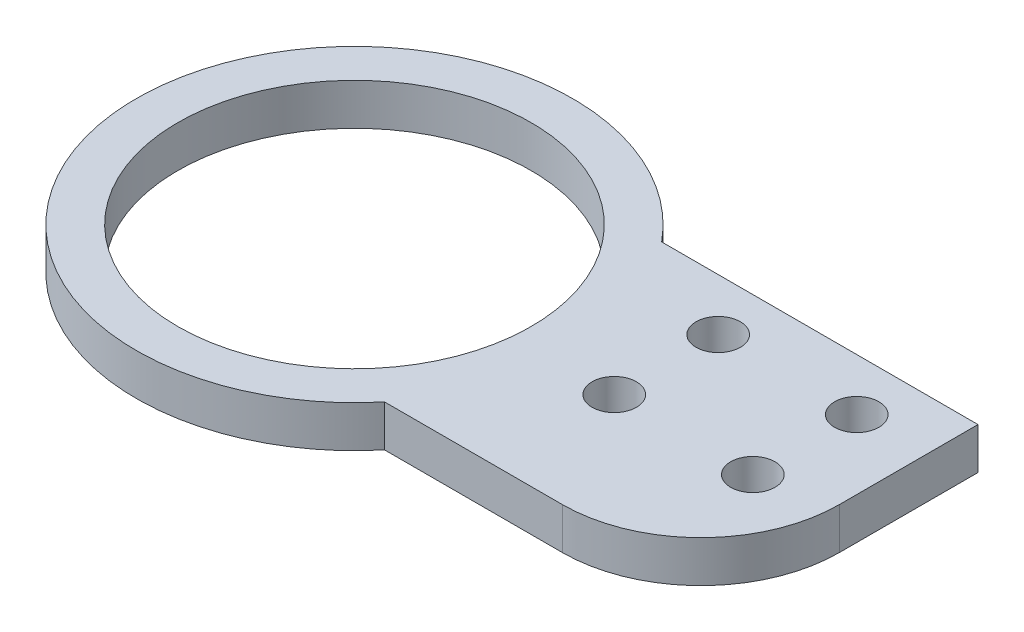
ISO-10303-21;
HEADER;
FILE_DESCRIPTION(('STEP AP214'),'2;1');
FILE_NAME('part.step','',(''),(''),'','','');
FILE_SCHEMA(('AUTOMOTIVE_DESIGN { 1 0 10303 214 1 1 1 1 }'));
ENDSEC;
DATA;
#1=APPLICATION_CONTEXT('core data for automotive mechanical design processes');
#2=APPLICATION_PROTOCOL_DEFINITION('international standard','automotive_design',2000,#1);
#3=PRODUCT_CONTEXT('',#1,'mechanical');
#4=PRODUCT('Part','Part','',(#3));
#5=PRODUCT_RELATED_PRODUCT_CATEGORY('part','',(#4));
#6=PRODUCT_DEFINITION_FORMATION('','',#4);
#7=PRODUCT_DEFINITION_CONTEXT('part definition',#1,'design');
#8=PRODUCT_DEFINITION('design','',#6,#7);
#9=PRODUCT_DEFINITION_SHAPE('','',#8);
#10=(LENGTH_UNIT() NAMED_UNIT(*) SI_UNIT(.MILLI.,.METRE.));
#11=(NAMED_UNIT(*) PLANE_ANGLE_UNIT() SI_UNIT($,.RADIAN.));
#12=(NAMED_UNIT(*) SI_UNIT($,.STERADIAN.) SOLID_ANGLE_UNIT());
#13=UNCERTAINTY_MEASURE_WITH_UNIT(LENGTH_MEASURE(1.E-05),#10,'distance_accuracy_value','');
#14=(GEOMETRIC_REPRESENTATION_CONTEXT(3) GLOBAL_UNCERTAINTY_ASSIGNED_CONTEXT((#13)) GLOBAL_UNIT_ASSIGNED_CONTEXT((#10,
#11,#12)) REPRESENTATION_CONTEXT('',''));
#15=CARTESIAN_POINT('',(0.,0.,0.));
#16=DIRECTION('',(0.,0.,1.));
#17=DIRECTION('',(1.,0.,0.));
#18=AXIS2_PLACEMENT_3D('',#15,#16,#17);
#19=CARTESIAN_POINT('',(0.,3.,0.));
#20=DIRECTION('',(0.,-1.,0.));
#21=DIRECTION('',(0.,0.,-1.));
#22=AXIS2_PLACEMENT_3D('',#19,#20,#21);
#23=PLANE('',#22);
#24=CARTESIAN_POINT('',(-7.5,3.,0.));
#25=DIRECTION('',(0.,1.,0.));
#26=DIRECTION('',(0.,0.,1.));
#27=AXIS2_PLACEMENT_3D('',#24,#25,#26);
#28=CIRCLE('',#27,12.75);
#29=CARTESIAN_POINT('',(-7.5,3.,12.75));
#30=VERTEX_POINT('',#29);
#31=EDGE_CURVE('E130',#30,#30,#28,.T.);
#32=ORIENTED_EDGE('',*,*,#31,.F.);
#33=EDGE_LOOP('',(#32));
#34=FACE_BOUND('',#33,.T.);
#35=CARTESIAN_POINT('',(12.5,3.,-6.25));
#36=DIRECTION('',(0.,1.,0.));
#37=DIRECTION('',(0.,0.,-1.));
#38=AXIS2_PLACEMENT_3D('',#35,#36,#37);
#39=CIRCLE('',#38,1.6);
#40=CARTESIAN_POINT('',(12.5,3.,-7.85));
#41=VERTEX_POINT('',#40);
#42=EDGE_CURVE('E143',#41,#41,#39,.T.);
#43=ORIENTED_EDGE('',*,*,#42,.F.);
#44=EDGE_LOOP('',(#43));
#45=FACE_BOUND('',#44,.T.);
#46=CARTESIAN_POINT('',(22.5,3.,1.25));
#47=DIRECTION('',(0.,1.,0.));
#48=DIRECTION('',(0.,0.,-1.));
#49=AXIS2_PLACEMENT_3D('',#46,#47,#48);
#50=CIRCLE('',#49,1.6);
#51=CARTESIAN_POINT('',(22.5,3.,-0.350000000000002));
#52=VERTEX_POINT('',#51);
#53=EDGE_CURVE('E150',#52,#52,#50,.T.);
#54=ORIENTED_EDGE('',*,*,#53,.F.);
#55=EDGE_LOOP('',(#54));
#56=FACE_BOUND('',#55,.T.);
#57=CARTESIAN_POINT('',(12.5,3.,1.25));
#58=DIRECTION('',(0.,1.,0.));
#59=DIRECTION('',(0.,0.,1.));
#60=AXIS2_PLACEMENT_3D('',#57,#58,#59);
#61=CIRCLE('',#60,1.6);
#62=CARTESIAN_POINT('',(12.5,3.,2.85));
#63=VERTEX_POINT('',#62);
#64=EDGE_CURVE('E137',#63,#63,#61,.T.);
#65=ORIENTED_EDGE('',*,*,#64,.F.);
#66=EDGE_LOOP('',(#65));
#67=FACE_BOUND('',#66,.T.);
#68=CARTESIAN_POINT('',(22.5,3.,-6.25));
#69=DIRECTION('',(0.,1.,0.));
#70=DIRECTION('',(0.,0.,1.));
#71=AXIS2_PLACEMENT_3D('',#68,#69,#70);
#72=CIRCLE('',#71,1.6);
#73=CARTESIAN_POINT('',(22.5,3.,-4.65));
#74=VERTEX_POINT('',#73);
#75=EDGE_CURVE('E146',#74,#74,#72,.T.);
#76=ORIENTED_EDGE('',*,*,#75,.F.);
#77=EDGE_LOOP('',(#76));
#78=FACE_BOUND('',#77,.T.);
#79=DIRECTION('',(1.,0.,0.));
#80=VECTOR('',#79,1.);
#81=CARTESIAN_POINT('',(27.5,3.,10.));
#82=LINE('',#81,#80);
#83=CARTESIAN_POINT('',(4.66809352363796,3.,10.));
#84=VERTEX_POINT('',#83);
#85=CARTESIAN_POINT('',(17.5,3.,10.));
#86=VERTEX_POINT('',#85);
#87=EDGE_CURVE('E103',#84,#86,#82,.T.);
#88=ORIENTED_EDGE('',*,*,#87,.T.);
#89=CARTESIAN_POINT('',(17.5,3.,0.));
#90=DIRECTION('',(0.,-1.,0.));
#91=DIRECTION('',(0.,0.,-1.));
#92=AXIS2_PLACEMENT_3D('',#89,#90,#91);
#93=CIRCLE('',#92,10.);
#94=CARTESIAN_POINT('',(27.5,3.,0.));
#95=VERTEX_POINT('',#94);
#96=EDGE_CURVE('E79',#86,#95,#93,.F.);
#97=ORIENTED_EDGE('',*,*,#96,.T.);
#98=DIRECTION('',(0.,0.,-1.));
#99=VECTOR('',#98,1.);
#100=CARTESIAN_POINT('',(27.5,3.,10.));
#101=LINE('',#100,#99);
#102=CARTESIAN_POINT('',(27.5,3.,-10.));
#103=VERTEX_POINT('',#102);
#104=EDGE_CURVE('E161',#95,#103,#101,.T.);
#105=ORIENTED_EDGE('',*,*,#104,.T.);
#106=DIRECTION('',(-1.,0.,0.));
#107=VECTOR('',#106,1.);
#108=CARTESIAN_POINT('',(-27.5,3.,-10.));
#109=LINE('',#108,#107);
#110=CARTESIAN_POINT('',(4.66809352363797,3.,-10.));
#111=VERTEX_POINT('',#110);
#112=EDGE_CURVE('E105',#103,#111,#109,.T.);
#113=ORIENTED_EDGE('',*,*,#112,.T.);
#114=CARTESIAN_POINT('',(-7.5,3.,0.));
#115=DIRECTION('',(0.,1.,0.));
#116=DIRECTION('',(0.,0.,1.));
#117=AXIS2_PLACEMENT_3D('',#114,#115,#116);
#118=CIRCLE('',#117,15.75);
#119=EDGE_CURVE('E100',#111,#84,#118,.T.);
#120=ORIENTED_EDGE('',*,*,#119,.T.);
#121=EDGE_LOOP('',(#88,#97,#105,#113,#120));
#122=FACE_BOUND('',#121,.T.);
#123=ADVANCED_FACE('F57',(#34,#45,#56,#67,#78,#122),#23,.F.);
#124=CARTESIAN_POINT('',(0.,0.,0.));
#125=DIRECTION('',(0.,-1.,0.));
#126=DIRECTION('',(0.,0.,-1.));
#127=AXIS2_PLACEMENT_3D('',#124,#125,#126);
#128=PLANE('',#127);
#129=CARTESIAN_POINT('',(-7.5,0.,0.));
#130=DIRECTION('',(0.,1.,0.));
#131=DIRECTION('',(0.,0.,1.));
#132=AXIS2_PLACEMENT_3D('',#129,#130,#131);
#133=CIRCLE('',#132,12.75);
#134=CARTESIAN_POINT('',(-7.5,0.,12.75));
#135=VERTEX_POINT('',#134);
#136=EDGE_CURVE('E131',#135,#135,#133,.T.);
#137=ORIENTED_EDGE('',*,*,#136,.T.);
#138=EDGE_LOOP('',(#137));
#139=FACE_BOUND('',#138,.T.);
#140=CARTESIAN_POINT('',(12.5,0.,-6.25));
#141=DIRECTION('',(0.,1.,0.));
#142=DIRECTION('',(0.,0.,-1.));
#143=AXIS2_PLACEMENT_3D('',#140,#141,#142);
#144=CIRCLE('',#143,1.6);
#145=CARTESIAN_POINT('',(12.5,0.,-7.85));
#146=VERTEX_POINT('',#145);
#147=EDGE_CURVE('E147',#146,#146,#144,.T.);
#148=ORIENTED_EDGE('',*,*,#147,.T.);
#149=EDGE_LOOP('',(#148));
#150=FACE_BOUND('',#149,.T.);
#151=CARTESIAN_POINT('',(22.5,0.,1.25));
#152=DIRECTION('',(0.,1.,0.));
#153=DIRECTION('',(0.,0.,-1.));
#154=AXIS2_PLACEMENT_3D('',#151,#152,#153);
#155=CIRCLE('',#154,1.6);
#156=CARTESIAN_POINT('',(22.5,0.,-0.350000000000002));
#157=VERTEX_POINT('',#156);
#158=EDGE_CURVE('E140',#157,#157,#155,.T.);
#159=ORIENTED_EDGE('',*,*,#158,.T.);
#160=EDGE_LOOP('',(#159));
#161=FACE_BOUND('',#160,.T.);
#162=CARTESIAN_POINT('',(12.5,0.,1.25));
#163=DIRECTION('',(0.,1.,0.));
#164=DIRECTION('',(0.,0.,1.));
#165=AXIS2_PLACEMENT_3D('',#162,#163,#164);
#166=CIRCLE('',#165,1.6);
#167=CARTESIAN_POINT('',(12.5,0.,2.85));
#168=VERTEX_POINT('',#167);
#169=EDGE_CURVE('E134',#168,#168,#166,.T.);
#170=ORIENTED_EDGE('',*,*,#169,.T.);
#171=EDGE_LOOP('',(#170));
#172=FACE_BOUND('',#171,.T.);
#173=CARTESIAN_POINT('',(22.5,0.,-6.25));
#174=DIRECTION('',(0.,1.,0.));
#175=DIRECTION('',(0.,0.,1.));
#176=AXIS2_PLACEMENT_3D('',#173,#174,#175);
#177=CIRCLE('',#176,1.6);
#178=CARTESIAN_POINT('',(22.5,0.,-4.65));
#179=VERTEX_POINT('',#178);
#180=EDGE_CURVE('E155',#179,#179,#177,.T.);
#181=ORIENTED_EDGE('',*,*,#180,.T.);
#182=EDGE_LOOP('',(#181));
#183=FACE_BOUND('',#182,.T.);
#184=DIRECTION('',(0.,0.,-1.));
#185=VECTOR('',#184,1.);
#186=CARTESIAN_POINT('',(27.5,0.,10.));
#187=LINE('',#186,#185);
#188=CARTESIAN_POINT('',(27.5,0.,0.));
#189=VERTEX_POINT('',#188);
#190=CARTESIAN_POINT('',(27.5,0.,-10.));
#191=VERTEX_POINT('',#190);
#192=EDGE_CURVE('E158',#189,#191,#187,.T.);
#193=ORIENTED_EDGE('',*,*,#192,.F.);
#194=CARTESIAN_POINT('',(17.5,0.,0.));
#195=DIRECTION('',(0.,-1.,0.));
#196=DIRECTION('',(0.,0.,-1.));
#197=AXIS2_PLACEMENT_3D('',#194,#195,#196);
#198=CIRCLE('',#197,10.);
#199=CARTESIAN_POINT('',(17.5,0.,10.));
#200=VERTEX_POINT('',#199);
#201=EDGE_CURVE('E13',#189,#200,#198,.T.);
#202=ORIENTED_EDGE('',*,*,#201,.T.);
#203=DIRECTION('',(1.,0.,0.));
#204=VECTOR('',#203,1.);
#205=CARTESIAN_POINT('',(27.5,0.,10.));
#206=LINE('',#205,#204);
#207=CARTESIAN_POINT('',(4.66809352363796,0.,10.));
#208=VERTEX_POINT('',#207);
#209=EDGE_CURVE('E118',#208,#200,#206,.T.);
#210=ORIENTED_EDGE('',*,*,#209,.F.);
#211=CARTESIAN_POINT('',(-7.5,0.,0.));
#212=DIRECTION('',(0.,1.,0.));
#213=DIRECTION('',(0.,0.,1.));
#214=AXIS2_PLACEMENT_3D('',#211,#212,#213);
#215=CIRCLE('',#214,15.75);
#216=CARTESIAN_POINT('',(4.66809352363797,0.,-10.));
#217=VERTEX_POINT('',#216);
#218=EDGE_CURVE('E109',#217,#208,#215,.T.);
#219=ORIENTED_EDGE('',*,*,#218,.F.);
#220=DIRECTION('',(-1.,0.,0.));
#221=VECTOR('',#220,1.);
#222=CARTESIAN_POINT('',(-27.5,0.,-10.));
#223=LINE('',#222,#221);
#224=EDGE_CURVE('E163',#191,#217,#223,.T.);
#225=ORIENTED_EDGE('',*,*,#224,.F.);
#226=EDGE_LOOP('',(#193,#202,#210,#219,#225));
#227=FACE_BOUND('',#226,.T.);
#228=ADVANCED_FACE('F178',(#139,#150,#161,#172,#183,#227),#128,.T.);
#229=CARTESIAN_POINT('',(27.5,3.,10.));
#230=DIRECTION('',(-1.,0.,0.));
#231=DIRECTION('',(0.,0.,1.));
#232=AXIS2_PLACEMENT_3D('',#229,#230,#231);
#233=PLANE('',#232);
#234=ORIENTED_EDGE('',*,*,#104,.F.);
#235=DIRECTION('',(0.,1.,0.));
#236=VECTOR('',#235,1.);
#237=CARTESIAN_POINT('',(27.5,0.,0.));
#238=LINE('',#237,#236);
#239=EDGE_CURVE('E65',#95,#189,#238,.F.);
#240=ORIENTED_EDGE('',*,*,#239,.T.);
#241=ORIENTED_EDGE('',*,*,#192,.T.);
#242=DIRECTION('',(0.,-1.,0.));
#243=VECTOR('',#242,1.);
#244=CARTESIAN_POINT('',(27.5,3.,-10.));
#245=LINE('',#244,#243);
#246=EDGE_CURVE('E165',#103,#191,#245,.T.);
#247=ORIENTED_EDGE('',*,*,#246,.F.);
#248=EDGE_LOOP('',(#234,#240,#241,#247));
#249=FACE_BOUND('',#248,.T.);
#250=ADVANCED_FACE('F175',(#249),#233,.F.);
#251=CARTESIAN_POINT('',(-27.5,3.,-10.));
#252=DIRECTION('',(0.,0.,1.));
#253=DIRECTION('',(1.,0.,0.));
#254=AXIS2_PLACEMENT_3D('',#251,#252,#253);
#255=PLANE('',#254);
#256=ORIENTED_EDGE('',*,*,#224,.T.);
#257=DIRECTION('',(0.,1.,0.));
#258=VECTOR('',#257,1.);
#259=CARTESIAN_POINT('',(4.66809352363797,0.,-10.));
#260=LINE('',#259,#258);
#261=EDGE_CURVE('E127',#217,#111,#260,.T.);
#262=ORIENTED_EDGE('',*,*,#261,.T.);
#263=ORIENTED_EDGE('',*,*,#112,.F.);
#264=ORIENTED_EDGE('',*,*,#246,.T.);
#265=EDGE_LOOP('',(#256,#262,#263,#264));
#266=FACE_BOUND('',#265,.T.);
#267=ADVANCED_FACE('F173',(#266),#255,.F.);
#268=CARTESIAN_POINT('',(22.5,0.,-6.25));
#269=DIRECTION('',(0.,1.,0.));
#270=DIRECTION('',(0.,0.,1.));
#271=AXIS2_PLACEMENT_3D('',#268,#269,#270);
#272=CYLINDRICAL_SURFACE('',#271,1.6);
#273=ORIENTED_EDGE('',*,*,#180,.F.);
#274=EDGE_LOOP('',(#273));
#275=FACE_BOUND('',#274,.T.);
#276=ORIENTED_EDGE('',*,*,#75,.T.);
#277=EDGE_LOOP('',(#276));
#278=FACE_BOUND('',#277,.T.);
#279=ADVANCED_FACE('F197',(#275,#278),#272,.F.);
#280=CARTESIAN_POINT('',(12.5,0.,1.25));
#281=DIRECTION('',(0.,1.,0.));
#282=DIRECTION('',(0.,0.,1.));
#283=AXIS2_PLACEMENT_3D('',#280,#281,#282);
#284=CYLINDRICAL_SURFACE('',#283,1.6);
#285=ORIENTED_EDGE('',*,*,#169,.F.);
#286=EDGE_LOOP('',(#285));
#287=FACE_BOUND('',#286,.T.);
#288=ORIENTED_EDGE('',*,*,#64,.T.);
#289=EDGE_LOOP('',(#288));
#290=FACE_BOUND('',#289,.T.);
#291=ADVANCED_FACE('F280',(#287,#290),#284,.F.);
#292=CARTESIAN_POINT('',(22.5,0.,1.25));
#293=DIRECTION('',(0.,1.,0.));
#294=DIRECTION('',(0.,0.,1.));
#295=AXIS2_PLACEMENT_3D('',#292,#293,#294);
#296=CYLINDRICAL_SURFACE('',#295,1.6);
#297=ORIENTED_EDGE('',*,*,#158,.F.);
#298=EDGE_LOOP('',(#297));
#299=FACE_BOUND('',#298,.T.);
#300=ORIENTED_EDGE('',*,*,#53,.T.);
#301=EDGE_LOOP('',(#300));
#302=FACE_BOUND('',#301,.T.);
#303=ADVANCED_FACE('F271',(#299,#302),#296,.F.);
#304=CARTESIAN_POINT('',(12.5,0.,-6.25));
#305=DIRECTION('',(0.,1.,0.));
#306=DIRECTION('',(0.,0.,1.));
#307=AXIS2_PLACEMENT_3D('',#304,#305,#306);
#308=CYLINDRICAL_SURFACE('',#307,1.6);
#309=ORIENTED_EDGE('',*,*,#147,.F.);
#310=EDGE_LOOP('',(#309));
#311=FACE_BOUND('',#310,.T.);
#312=ORIENTED_EDGE('',*,*,#42,.T.);
#313=EDGE_LOOP('',(#312));
#314=FACE_BOUND('',#313,.T.);
#315=ADVANCED_FACE('F262',(#311,#314),#308,.F.);
#316=CARTESIAN_POINT('',(-7.5,0.,0.));
#317=DIRECTION('',(0.,1.,0.));
#318=DIRECTION('',(0.,0.,1.));
#319=AXIS2_PLACEMENT_3D('',#316,#317,#318);
#320=CYLINDRICAL_SURFACE('',#319,12.75);
#321=ORIENTED_EDGE('',*,*,#136,.F.);
#322=EDGE_LOOP('',(#321));
#323=FACE_BOUND('',#322,.T.);
#324=ORIENTED_EDGE('',*,*,#31,.T.);
#325=EDGE_LOOP('',(#324));
#326=FACE_BOUND('',#325,.T.);
#327=ADVANCED_FACE('F225',(#323,#326),#320,.F.);
#328=CARTESIAN_POINT('',(-7.5,0.,0.));
#329=DIRECTION('',(0.,1.,0.));
#330=DIRECTION('',(0.,0.,1.));
#331=AXIS2_PLACEMENT_3D('',#328,#329,#330);
#332=CYLINDRICAL_SURFACE('',#331,15.75);
#333=ORIENTED_EDGE('',*,*,#119,.F.);
#334=ORIENTED_EDGE('',*,*,#261,.F.);
#335=ORIENTED_EDGE('',*,*,#218,.T.);
#336=DIRECTION('',(0.,1.,0.));
#337=VECTOR('',#336,1.);
#338=CARTESIAN_POINT('',(4.66809352363796,0.,10.));
#339=LINE('',#338,#337);
#340=EDGE_CURVE('E110',#208,#84,#339,.T.);
#341=ORIENTED_EDGE('',*,*,#340,.T.);
#342=EDGE_LOOP('',(#333,#334,#335,#341));
#343=FACE_BOUND('',#342,.T.);
#344=ADVANCED_FACE('F113',(#343),#332,.T.);
#345=CARTESIAN_POINT('',(27.5,0.,10.));
#346=DIRECTION('',(0.,0.,1.));
#347=DIRECTION('',(1.,0.,0.));
#348=AXIS2_PLACEMENT_3D('',#345,#346,#347);
#349=PLANE('',#348);
#350=ORIENTED_EDGE('',*,*,#209,.T.);
#351=DIRECTION('',(0.,1.,0.));
#352=VECTOR('',#351,1.);
#353=CARTESIAN_POINT('',(17.5,3.,10.));
#354=LINE('',#353,#352);
#355=EDGE_CURVE('E123',#200,#86,#354,.T.);
#356=ORIENTED_EDGE('',*,*,#355,.T.);
#357=ORIENTED_EDGE('',*,*,#87,.F.);
#358=ORIENTED_EDGE('',*,*,#340,.F.);
#359=EDGE_LOOP('',(#350,#356,#357,#358));
#360=FACE_BOUND('',#359,.T.);
#361=ADVANCED_FACE('F121',(#360),#349,.T.);
#362=CARTESIAN_POINT('',(17.5,0.,0.));
#363=DIRECTION('',(0.,-1.,0.));
#364=DIRECTION('',(0.,0.,-1.));
#365=AXIS2_PLACEMENT_3D('',#362,#363,#364);
#366=CYLINDRICAL_SURFACE('',#365,10.);
#367=ORIENTED_EDGE('',*,*,#201,.F.);
#368=ORIENTED_EDGE('',*,*,#239,.F.);
#369=ORIENTED_EDGE('',*,*,#96,.F.);
#370=ORIENTED_EDGE('',*,*,#355,.F.);
#371=EDGE_LOOP('',(#367,#368,#369,#370));
#372=FACE_BOUND('',#371,.T.);
#373=ADVANCED_FACE('F59',(#372),#366,.T.);
#374=CLOSED_SHELL('',(#123,#228,#250,#267,#279,#291,#303,#315,#327,#344,#361,#373));
#375=MANIFOLD_SOLID_BREP('B2',#374);
#376=ADVANCED_BREP_SHAPE_REPRESENTATION('',(#18,#375),#14);
#377=SHAPE_DEFINITION_REPRESENTATION(#9,#376);
ENDSEC;
END-ISO-10303-21;
